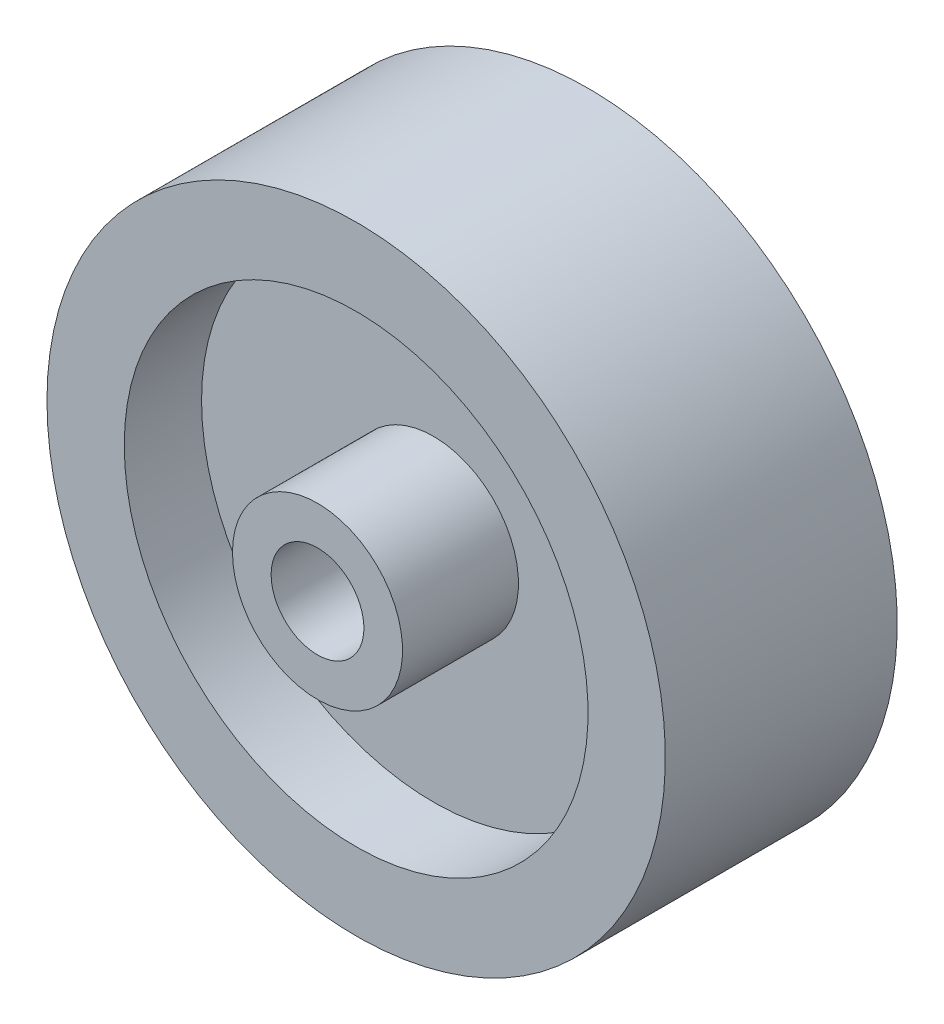
ISO-10303-21;
HEADER;
FILE_DESCRIPTION(('STEP AP214'),'2;1');
FILE_NAME('part.step','',(''),(''),'','','');
FILE_SCHEMA(('AUTOMOTIVE_DESIGN { 1 0 10303 214 1 1 1 1 }'));
ENDSEC;
DATA;
#1=APPLICATION_CONTEXT('core data for automotive mechanical design processes');
#2=APPLICATION_PROTOCOL_DEFINITION('international standard','automotive_design',2000,#1);
#3=PRODUCT_CONTEXT('',#1,'mechanical');
#4=PRODUCT('Part','Part','',(#3));
#5=PRODUCT_RELATED_PRODUCT_CATEGORY('part','',(#4));
#6=PRODUCT_DEFINITION_FORMATION('','',#4);
#7=PRODUCT_DEFINITION_CONTEXT('part definition',#1,'design');
#8=PRODUCT_DEFINITION('design','',#6,#7);
#9=PRODUCT_DEFINITION_SHAPE('','',#8);
#10=(LENGTH_UNIT() NAMED_UNIT(*) SI_UNIT(.MILLI.,.METRE.));
#11=(NAMED_UNIT(*) PLANE_ANGLE_UNIT() SI_UNIT($,.RADIAN.));
#12=(NAMED_UNIT(*) SI_UNIT($,.STERADIAN.) SOLID_ANGLE_UNIT());
#13=UNCERTAINTY_MEASURE_WITH_UNIT(LENGTH_MEASURE(1.E-05),#10,'distance_accuracy_value','');
#14=(GEOMETRIC_REPRESENTATION_CONTEXT(3) GLOBAL_UNCERTAINTY_ASSIGNED_CONTEXT((#13)) GLOBAL_UNIT_ASSIGNED_CONTEXT((#10,
#11,#12)) REPRESENTATION_CONTEXT('',''));
#15=CARTESIAN_POINT('',(0.,0.,0.));
#16=DIRECTION('',(0.,0.,1.));
#17=DIRECTION('',(1.,0.,0.));
#18=AXIS2_PLACEMENT_3D('',#15,#16,#17);
#19=CARTESIAN_POINT('',(-6.00000000000001,0.,-20.));
#20=DIRECTION('',(0.,0.,-1.));
#21=DIRECTION('',(-1.,0.,0.));
#22=AXIS2_PLACEMENT_3D('',#19,#20,#21);
#23=PLANE('',#22);
#24=CARTESIAN_POINT('',(0.,0.,-20.));
#25=DIRECTION('',(0.,0.,-1.));
#26=DIRECTION('',(-1.,0.,0.));
#27=AXIS2_PLACEMENT_3D('',#24,#25,#26);
#28=CIRCLE('',#27,11.);
#29=CARTESIAN_POINT('',(-11.,0.,-20.));
#30=VERTEX_POINT('',#29);
#31=EDGE_CURVE('E10',#30,#30,#28,.T.);
#32=ORIENTED_EDGE('',*,*,#31,.T.);
#33=EDGE_LOOP('',(#32));
#34=FACE_BOUND('',#33,.T.);
#35=CARTESIAN_POINT('',(0.,0.,-20.));
#36=DIRECTION('',(0.,0.,-1.));
#37=DIRECTION('',(-1.,0.,0.));
#38=AXIS2_PLACEMENT_3D('',#35,#36,#37);
#39=CIRCLE('',#38,6.00000000000001);
#40=CARTESIAN_POINT('',(-6.00000000000001,0.,-20.));
#41=VERTEX_POINT('',#40);
#42=EDGE_CURVE('E75',#41,#41,#39,.T.);
#43=ORIENTED_EDGE('',*,*,#42,.F.);
#44=EDGE_LOOP('',(#43));
#45=FACE_BOUND('',#44,.T.);
#46=ADVANCED_FACE('F35',(#34,#45),#23,.T.);
#47=CARTESIAN_POINT('',(0.,0.,-39.6203023067869));
#48=DIRECTION('',(0.,0.,-1.));
#49=DIRECTION('',(-1.,0.,0.));
#50=AXIS2_PLACEMENT_3D('',#47,#48,#49);
#51=CYLINDRICAL_SURFACE('',#50,11.);
#52=CARTESIAN_POINT('',(0.,0.,-5.));
#53=DIRECTION('',(0.,0.,-1.));
#54=DIRECTION('',(-1.,0.,0.));
#55=AXIS2_PLACEMENT_3D('',#52,#53,#54);
#56=CIRCLE('',#55,11.);
#57=CARTESIAN_POINT('',(-11.,0.,-5.));
#58=VERTEX_POINT('',#57);
#59=EDGE_CURVE('E41',#58,#58,#56,.T.);
#60=ORIENTED_EDGE('',*,*,#59,.T.);
#61=EDGE_LOOP('',(#60));
#62=FACE_BOUND('',#61,.T.);
#63=ORIENTED_EDGE('',*,*,#31,.F.);
#64=EDGE_LOOP('',(#63));
#65=FACE_BOUND('',#64,.T.);
#66=ADVANCED_FACE('F83',(#62,#65),#51,.T.);
#67=CARTESIAN_POINT('',(-11.,0.,-5.));
#68=DIRECTION('',(0.,0.,-1.));
#69=DIRECTION('',(-1.,0.,0.));
#70=AXIS2_PLACEMENT_3D('',#67,#68,#69);
#71=PLANE('',#70);
#72=CARTESIAN_POINT('',(0.,0.,-5.));
#73=DIRECTION('',(0.,0.,-1.));
#74=DIRECTION('',(-1.,0.,0.));
#75=AXIS2_PLACEMENT_3D('',#72,#73,#74);
#76=CIRCLE('',#75,30.);
#77=CARTESIAN_POINT('',(-30.,0.,-5.));
#78=VERTEX_POINT('',#77);
#79=EDGE_CURVE('E45',#78,#78,#76,.T.);
#80=ORIENTED_EDGE('',*,*,#79,.T.);
#81=EDGE_LOOP('',(#80));
#82=FACE_BOUND('',#81,.T.);
#83=ORIENTED_EDGE('',*,*,#59,.F.);
#84=EDGE_LOOP('',(#83));
#85=FACE_BOUND('',#84,.T.);
#86=ADVANCED_FACE('F87',(#82,#85),#71,.T.);
#87=CARTESIAN_POINT('',(0.,0.,-39.6203023067869));
#88=DIRECTION('',(0.,0.,-1.));
#89=DIRECTION('',(-1.,0.,0.));
#90=AXIS2_PLACEMENT_3D('',#87,#88,#89);
#91=CYLINDRICAL_SURFACE('',#90,30.);
#92=CARTESIAN_POINT('',(0.,0.,-15.));
#93=DIRECTION('',(0.,0.,-1.));
#94=DIRECTION('',(-1.,0.,0.));
#95=AXIS2_PLACEMENT_3D('',#92,#93,#94);
#96=CIRCLE('',#95,30.);
#97=CARTESIAN_POINT('',(-30.,0.,-15.));
#98=VERTEX_POINT('',#97);
#99=EDGE_CURVE('E49',#98,#98,#96,.T.);
#100=ORIENTED_EDGE('',*,*,#99,.T.);
#101=EDGE_LOOP('',(#100));
#102=FACE_BOUND('',#101,.T.);
#103=ORIENTED_EDGE('',*,*,#79,.F.);
#104=EDGE_LOOP('',(#103));
#105=FACE_BOUND('',#104,.T.);
#106=ADVANCED_FACE('F91',(#102,#105),#91,.F.);
#107=CARTESIAN_POINT('',(-30.,0.,-15.));
#108=DIRECTION('',(0.,0.,-1.));
#109=DIRECTION('',(-1.,0.,0.));
#110=AXIS2_PLACEMENT_3D('',#107,#108,#109);
#111=PLANE('',#110);
#112=CARTESIAN_POINT('',(0.,0.,-15.));
#113=DIRECTION('',(0.,0.,-1.));
#114=DIRECTION('',(-1.,0.,0.));
#115=AXIS2_PLACEMENT_3D('',#112,#113,#114);
#116=CIRCLE('',#115,40.);
#117=CARTESIAN_POINT('',(-40.,0.,-15.));
#118=VERTEX_POINT('',#117);
#119=EDGE_CURVE('E54',#118,#118,#116,.T.);
#120=ORIENTED_EDGE('',*,*,#119,.T.);
#121=EDGE_LOOP('',(#120));
#122=FACE_BOUND('',#121,.T.);
#123=ORIENTED_EDGE('',*,*,#99,.F.);
#124=EDGE_LOOP('',(#123));
#125=FACE_BOUND('',#124,.T.);
#126=ADVANCED_FACE('F98',(#122,#125),#111,.T.);
#127=CARTESIAN_POINT('',(0.,0.,-39.6203023067869));
#128=DIRECTION('',(0.,0.,-1.));
#129=DIRECTION('',(-1.,0.,0.));
#130=AXIS2_PLACEMENT_3D('',#127,#128,#129);
#131=CYLINDRICAL_SURFACE('',#130,40.);
#132=CARTESIAN_POINT('',(0.,0.,15.));
#133=DIRECTION('',(0.,0.,-1.));
#134=DIRECTION('',(-1.,0.,0.));
#135=AXIS2_PLACEMENT_3D('',#132,#133,#134);
#136=CIRCLE('',#135,40.);
#137=CARTESIAN_POINT('',(-40.,0.,15.));
#138=VERTEX_POINT('',#137);
#139=EDGE_CURVE('E57',#138,#138,#136,.T.);
#140=ORIENTED_EDGE('',*,*,#139,.T.);
#141=EDGE_LOOP('',(#140));
#142=FACE_BOUND('',#141,.T.);
#143=ORIENTED_EDGE('',*,*,#119,.F.);
#144=EDGE_LOOP('',(#143));
#145=FACE_BOUND('',#144,.T.);
#146=ADVANCED_FACE('F102',(#142,#145),#131,.T.);
#147=CARTESIAN_POINT('',(-30.,0.,15.));
#148=DIRECTION('',(0.,0.,1.));
#149=DIRECTION('',(1.,0.,0.));
#150=AXIS2_PLACEMENT_3D('',#147,#148,#149);
#151=PLANE('',#150);
#152=CARTESIAN_POINT('',(0.,0.,15.));
#153=DIRECTION('',(0.,0.,-1.));
#154=DIRECTION('',(-1.,0.,0.));
#155=AXIS2_PLACEMENT_3D('',#152,#153,#154);
#156=CIRCLE('',#155,30.);
#157=CARTESIAN_POINT('',(-30.,0.,15.));
#158=VERTEX_POINT('',#157);
#159=EDGE_CURVE('E60',#158,#158,#156,.T.);
#160=ORIENTED_EDGE('',*,*,#159,.T.);
#161=EDGE_LOOP('',(#160));
#162=FACE_BOUND('',#161,.T.);
#163=ORIENTED_EDGE('',*,*,#139,.F.);
#164=EDGE_LOOP('',(#163));
#165=FACE_BOUND('',#164,.T.);
#166=ADVANCED_FACE('F106',(#162,#165),#151,.T.);
#167=CARTESIAN_POINT('',(0.,0.,-39.6203023067869));
#168=DIRECTION('',(0.,0.,-1.));
#169=DIRECTION('',(-1.,0.,0.));
#170=AXIS2_PLACEMENT_3D('',#167,#168,#169);
#171=CYLINDRICAL_SURFACE('',#170,30.);
#172=CARTESIAN_POINT('',(0.,0.,5.));
#173=DIRECTION('',(0.,0.,-1.));
#174=DIRECTION('',(-1.,0.,0.));
#175=AXIS2_PLACEMENT_3D('',#172,#173,#174);
#176=CIRCLE('',#175,30.);
#177=CARTESIAN_POINT('',(-30.,0.,5.));
#178=VERTEX_POINT('',#177);
#179=EDGE_CURVE('E63',#178,#178,#176,.T.);
#180=ORIENTED_EDGE('',*,*,#179,.T.);
#181=EDGE_LOOP('',(#180));
#182=FACE_BOUND('',#181,.T.);
#183=ORIENTED_EDGE('',*,*,#159,.F.);
#184=EDGE_LOOP('',(#183));
#185=FACE_BOUND('',#184,.T.);
#186=ADVANCED_FACE('F110',(#182,#185),#171,.F.);
#187=CARTESIAN_POINT('',(-11.,0.,5.));
#188=DIRECTION('',(0.,0.,1.));
#189=DIRECTION('',(1.,0.,0.));
#190=AXIS2_PLACEMENT_3D('',#187,#188,#189);
#191=PLANE('',#190);
#192=CARTESIAN_POINT('',(0.,0.,5.));
#193=DIRECTION('',(0.,0.,-1.));
#194=DIRECTION('',(-1.,0.,0.));
#195=AXIS2_PLACEMENT_3D('',#192,#193,#194);
#196=CIRCLE('',#195,11.);
#197=CARTESIAN_POINT('',(-11.,0.,5.));
#198=VERTEX_POINT('',#197);
#199=EDGE_CURVE('E66',#198,#198,#196,.T.);
#200=ORIENTED_EDGE('',*,*,#199,.T.);
#201=EDGE_LOOP('',(#200));
#202=FACE_BOUND('',#201,.T.);
#203=ORIENTED_EDGE('',*,*,#179,.F.);
#204=EDGE_LOOP('',(#203));
#205=FACE_BOUND('',#204,.T.);
#206=ADVANCED_FACE('F114',(#202,#205),#191,.T.);
#207=CARTESIAN_POINT('',(0.,0.,-39.6203023067869));
#208=DIRECTION('',(0.,0.,-1.));
#209=DIRECTION('',(-1.,0.,0.));
#210=AXIS2_PLACEMENT_3D('',#207,#208,#209);
#211=CYLINDRICAL_SURFACE('',#210,11.);
#212=CARTESIAN_POINT('',(0.,0.,20.));
#213=DIRECTION('',(0.,0.,-1.));
#214=DIRECTION('',(-1.,0.,0.));
#215=AXIS2_PLACEMENT_3D('',#212,#213,#214);
#216=CIRCLE('',#215,11.);
#217=CARTESIAN_POINT('',(-11.,0.,20.));
#218=VERTEX_POINT('',#217);
#219=EDGE_CURVE('E69',#218,#218,#216,.T.);
#220=ORIENTED_EDGE('',*,*,#219,.T.);
#221=EDGE_LOOP('',(#220));
#222=FACE_BOUND('',#221,.T.);
#223=ORIENTED_EDGE('',*,*,#199,.F.);
#224=EDGE_LOOP('',(#223));
#225=FACE_BOUND('',#224,.T.);
#226=ADVANCED_FACE('F118',(#222,#225),#211,.T.);
#227=CARTESIAN_POINT('',(-6.,0.,20.));
#228=DIRECTION('',(0.,0.,1.));
#229=DIRECTION('',(1.,0.,0.));
#230=AXIS2_PLACEMENT_3D('',#227,#228,#229);
#231=PLANE('',#230);
#232=CARTESIAN_POINT('',(0.,0.,20.));
#233=DIRECTION('',(0.,0.,-1.));
#234=DIRECTION('',(-1.,0.,0.));
#235=AXIS2_PLACEMENT_3D('',#232,#233,#234);
#236=CIRCLE('',#235,6.);
#237=CARTESIAN_POINT('',(-6.,0.,20.));
#238=VERTEX_POINT('',#237);
#239=EDGE_CURVE('E72',#238,#238,#236,.T.);
#240=ORIENTED_EDGE('',*,*,#239,.T.);
#241=EDGE_LOOP('',(#240));
#242=FACE_BOUND('',#241,.T.);
#243=ORIENTED_EDGE('',*,*,#219,.F.);
#244=EDGE_LOOP('',(#243));
#245=FACE_BOUND('',#244,.T.);
#246=ADVANCED_FACE('F122',(#242,#245),#231,.T.);
#247=CARTESIAN_POINT('',(0.,0.,-39.6203023067869));
#248=DIRECTION('',(0.,0.,-1.));
#249=DIRECTION('',(-1.,0.,0.));
#250=AXIS2_PLACEMENT_3D('',#247,#248,#249);
#251=CYLINDRICAL_SURFACE('',#250,6.);
#252=ORIENTED_EDGE('',*,*,#42,.T.);
#253=EDGE_LOOP('',(#252));
#254=FACE_BOUND('',#253,.T.);
#255=ORIENTED_EDGE('',*,*,#239,.F.);
#256=EDGE_LOOP('',(#255));
#257=FACE_BOUND('',#256,.T.);
#258=ADVANCED_FACE('F79',(#254,#257),#251,.F.);
#259=CLOSED_SHELL('',(#46,#66,#86,#106,#126,#146,#166,#186,#206,#226,#246,#258));
#260=MANIFOLD_SOLID_BREP('B2',#259);
#261=ADVANCED_BREP_SHAPE_REPRESENTATION('',(#18,#260),#14);
#262=SHAPE_DEFINITION_REPRESENTATION(#9,#261);
ENDSEC;
END-ISO-10303-21;
